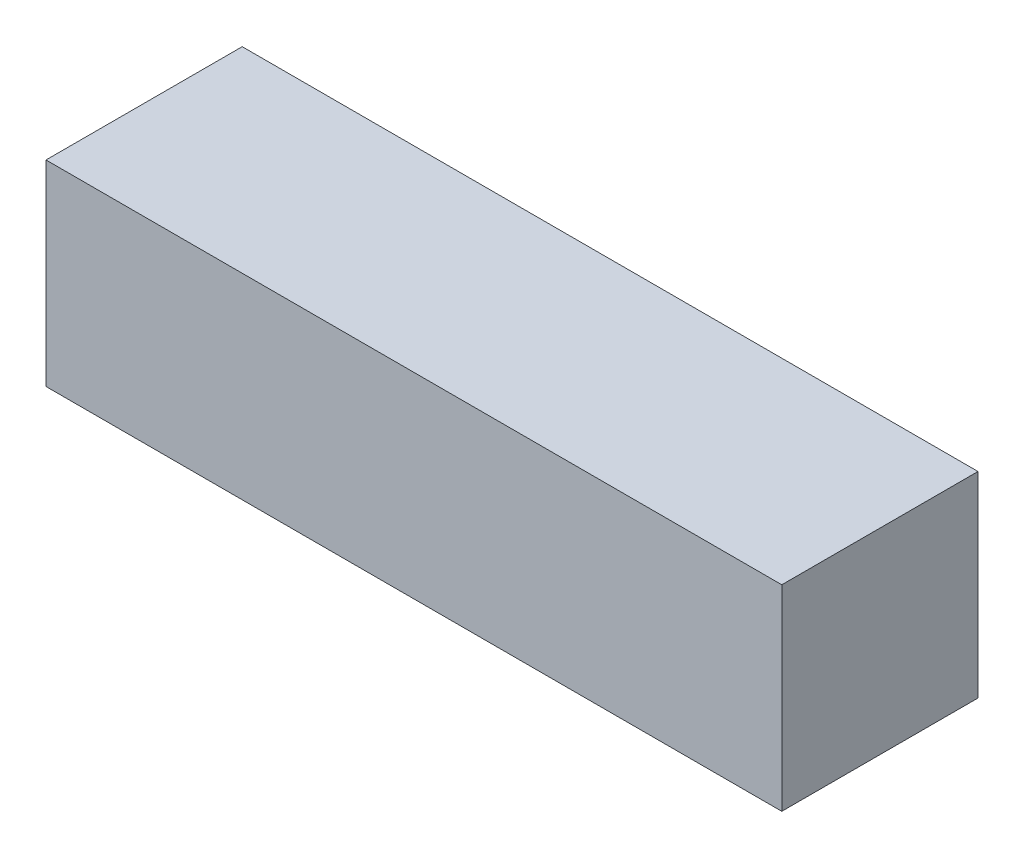
ISO-10303-21;
HEADER;
FILE_DESCRIPTION(('STEP AP214'),'2;1');
FILE_NAME('part.step','',(''),(''),'','','');
FILE_SCHEMA(('AUTOMOTIVE_DESIGN { 1 0 10303 214 1 1 1 1 }'));
ENDSEC;
DATA;
#1=APPLICATION_CONTEXT('core data for automotive mechanical design processes');
#2=APPLICATION_PROTOCOL_DEFINITION('international standard','automotive_design',2000,#1);
#3=PRODUCT_CONTEXT('',#1,'mechanical');
#4=PRODUCT('Part','Part','',(#3));
#5=PRODUCT_RELATED_PRODUCT_CATEGORY('part','',(#4));
#6=PRODUCT_DEFINITION_FORMATION('','',#4);
#7=PRODUCT_DEFINITION_CONTEXT('part definition',#1,'design');
#8=PRODUCT_DEFINITION('design','',#6,#7);
#9=PRODUCT_DEFINITION_SHAPE('','',#8);
#10=(LENGTH_UNIT() NAMED_UNIT(*) SI_UNIT(.MILLI.,.METRE.));
#11=(NAMED_UNIT(*) PLANE_ANGLE_UNIT() SI_UNIT($,.RADIAN.));
#12=(NAMED_UNIT(*) SI_UNIT($,.STERADIAN.) SOLID_ANGLE_UNIT());
#13=UNCERTAINTY_MEASURE_WITH_UNIT(LENGTH_MEASURE(1.E-05),#10,'distance_accuracy_value','');
#14=(GEOMETRIC_REPRESENTATION_CONTEXT(3) GLOBAL_UNCERTAINTY_ASSIGNED_CONTEXT((#13)) GLOBAL_UNIT_ASSIGNED_CONTEXT((#10,
#11,#12)) REPRESENTATION_CONTEXT('',''));
#15=CARTESIAN_POINT('',(0.,0.,0.));
#16=DIRECTION('',(0.,0.,1.));
#17=DIRECTION('',(1.,0.,0.));
#18=AXIS2_PLACEMENT_3D('',#15,#16,#17);
#19=CARTESIAN_POINT('',(0.,40.,0.));
#20=DIRECTION('',(1.,0.,0.));
#21=DIRECTION('',(0.,0.,-1.));
#22=AXIS2_PLACEMENT_3D('',#19,#20,#21);
#23=PLANE('',#22);
#24=DIRECTION('',(0.,0.,1.));
#25=VECTOR('',#24,1.);
#26=CARTESIAN_POINT('',(0.,0.,0.));
#27=LINE('',#26,#25);
#28=CARTESIAN_POINT('',(0.,0.,-40.));
#29=VERTEX_POINT('',#28);
#30=CARTESIAN_POINT('',(0.,0.,0.));
#31=VERTEX_POINT('',#30);
#32=EDGE_CURVE('E96',#29,#31,#27,.T.);
#33=ORIENTED_EDGE('',*,*,#32,.T.);
#34=DIRECTION('',(0.,-1.,0.));
#35=VECTOR('',#34,1.);
#36=CARTESIAN_POINT('',(0.,40.,0.));
#37=LINE('',#36,#35);
#38=CARTESIAN_POINT('',(0.,40.,0.));
#39=VERTEX_POINT('',#38);
#40=EDGE_CURVE('E11',#39,#31,#37,.T.);
#41=ORIENTED_EDGE('',*,*,#40,.F.);
#42=DIRECTION('',(0.,0.,1.));
#43=VECTOR('',#42,1.);
#44=CARTESIAN_POINT('',(0.,40.,0.));
#45=LINE('',#44,#43);
#46=CARTESIAN_POINT('',(0.,40.,-40.));
#47=VERTEX_POINT('',#46);
#48=EDGE_CURVE('E84',#47,#39,#45,.T.);
#49=ORIENTED_EDGE('',*,*,#48,.F.);
#50=DIRECTION('',(0.,-1.,0.));
#51=VECTOR('',#50,1.);
#52=CARTESIAN_POINT('',(0.,40.,-40.));
#53=LINE('',#52,#51);
#54=EDGE_CURVE('E92',#47,#29,#53,.T.);
#55=ORIENTED_EDGE('',*,*,#54,.T.);
#56=EDGE_LOOP('',(#33,#41,#49,#55));
#57=FACE_BOUND('',#56,.T.);
#58=ADVANCED_FACE('F33',(#57),#23,.F.);
#59=CARTESIAN_POINT('',(0.,40.,0.));
#60=DIRECTION('',(0.,0.,-1.));
#61=DIRECTION('',(-1.,0.,0.));
#62=AXIS2_PLACEMENT_3D('',#59,#60,#61);
#63=PLANE('',#62);
#64=DIRECTION('',(1.,0.,0.));
#65=VECTOR('',#64,1.);
#66=CARTESIAN_POINT('',(0.,0.,0.));
#67=LINE('',#66,#65);
#68=CARTESIAN_POINT('',(150.,0.,0.));
#69=VERTEX_POINT('',#68);
#70=EDGE_CURVE('E88',#31,#69,#67,.T.);
#71=ORIENTED_EDGE('',*,*,#70,.T.);
#72=DIRECTION('',(0.,-1.,0.));
#73=VECTOR('',#72,1.);
#74=CARTESIAN_POINT('',(150.,40.,0.));
#75=LINE('',#74,#73);
#76=CARTESIAN_POINT('',(150.,40.,0.));
#77=VERTEX_POINT('',#76);
#78=EDGE_CURVE('E41',#77,#69,#75,.T.);
#79=ORIENTED_EDGE('',*,*,#78,.F.);
#80=DIRECTION('',(1.,0.,0.));
#81=VECTOR('',#80,1.);
#82=CARTESIAN_POINT('',(0.,40.,0.));
#83=LINE('',#82,#81);
#84=EDGE_CURVE('E79',#39,#77,#83,.T.);
#85=ORIENTED_EDGE('',*,*,#84,.F.);
#86=ORIENTED_EDGE('',*,*,#40,.T.);
#87=EDGE_LOOP('',(#71,#79,#85,#86));
#88=FACE_BOUND('',#87,.T.);
#89=ADVANCED_FACE('F87',(#88),#63,.F.);
#90=CARTESIAN_POINT('',(150.,40.,0.));
#91=DIRECTION('',(-1.,0.,0.));
#92=DIRECTION('',(0.,0.,1.));
#93=AXIS2_PLACEMENT_3D('',#90,#91,#92);
#94=PLANE('',#93);
#95=DIRECTION('',(0.,0.,-1.));
#96=VECTOR('',#95,1.);
#97=CARTESIAN_POINT('',(150.,0.,0.));
#98=LINE('',#97,#96);
#99=CARTESIAN_POINT('',(150.,0.,-40.));
#100=VERTEX_POINT('',#99);
#101=EDGE_CURVE('E66',#69,#100,#98,.T.);
#102=ORIENTED_EDGE('',*,*,#101,.T.);
#103=DIRECTION('',(0.,-1.,0.));
#104=VECTOR('',#103,1.);
#105=CARTESIAN_POINT('',(150.,40.,-40.));
#106=LINE('',#105,#104);
#107=CARTESIAN_POINT('',(150.,40.,-40.));
#108=VERTEX_POINT('',#107);
#109=EDGE_CURVE('E89',#108,#100,#106,.T.);
#110=ORIENTED_EDGE('',*,*,#109,.F.);
#111=DIRECTION('',(0.,0.,-1.));
#112=VECTOR('',#111,1.);
#113=CARTESIAN_POINT('',(150.,40.,0.));
#114=LINE('',#113,#112);
#115=EDGE_CURVE('E82',#77,#108,#114,.T.);
#116=ORIENTED_EDGE('',*,*,#115,.F.);
#117=ORIENTED_EDGE('',*,*,#78,.T.);
#118=EDGE_LOOP('',(#102,#110,#116,#117));
#119=FACE_BOUND('',#118,.T.);
#120=ADVANCED_FACE('F90',(#119),#94,.F.);
#121=CARTESIAN_POINT('',(0.,40.,-40.));
#122=DIRECTION('',(0.,0.,1.));
#123=DIRECTION('',(1.,0.,0.));
#124=AXIS2_PLACEMENT_3D('',#121,#122,#123);
#125=PLANE('',#124);
#126=DIRECTION('',(-1.,0.,0.));
#127=VECTOR('',#126,1.);
#128=CARTESIAN_POINT('',(0.,0.,-40.));
#129=LINE('',#128,#127);
#130=EDGE_CURVE('E72',#100,#29,#129,.T.);
#131=ORIENTED_EDGE('',*,*,#130,.T.);
#132=ORIENTED_EDGE('',*,*,#54,.F.);
#133=DIRECTION('',(-1.,0.,0.));
#134=VECTOR('',#133,1.);
#135=CARTESIAN_POINT('',(0.,40.,-40.));
#136=LINE('',#135,#134);
#137=EDGE_CURVE('E49',#108,#47,#136,.T.);
#138=ORIENTED_EDGE('',*,*,#137,.F.);
#139=ORIENTED_EDGE('',*,*,#109,.T.);
#140=EDGE_LOOP('',(#131,#132,#138,#139));
#141=FACE_BOUND('',#140,.T.);
#142=ADVANCED_FACE('F103',(#141),#125,.F.);
#143=CARTESIAN_POINT('',(0.,40.,0.));
#144=DIRECTION('',(0.,-1.,0.));
#145=DIRECTION('',(0.,0.,-1.));
#146=AXIS2_PLACEMENT_3D('',#143,#144,#145);
#147=PLANE('',#146);
#148=ORIENTED_EDGE('',*,*,#48,.T.);
#149=ORIENTED_EDGE('',*,*,#84,.T.);
#150=ORIENTED_EDGE('',*,*,#115,.T.);
#151=ORIENTED_EDGE('',*,*,#137,.T.);
#152=EDGE_LOOP('',(#148,#149,#150,#151));
#153=FACE_BOUND('',#152,.T.);
#154=ADVANCED_FACE('F80',(#153),#147,.F.);
#155=CARTESIAN_POINT('',(0.,0.,0.));
#156=DIRECTION('',(0.,-1.,0.));
#157=DIRECTION('',(0.,0.,-1.));
#158=AXIS2_PLACEMENT_3D('',#155,#156,#157);
#159=PLANE('',#158);
#160=ORIENTED_EDGE('',*,*,#32,.F.);
#161=ORIENTED_EDGE('',*,*,#130,.F.);
#162=ORIENTED_EDGE('',*,*,#101,.F.);
#163=ORIENTED_EDGE('',*,*,#70,.F.);
#164=EDGE_LOOP('',(#160,#161,#162,#163));
#165=FACE_BOUND('',#164,.T.);
#166=ADVANCED_FACE('F106',(#165),#159,.T.);
#167=CLOSED_SHELL('',(#58,#89,#120,#142,#154,#166));
#168=MANIFOLD_SOLID_BREP('B2',#167);
#169=ADVANCED_BREP_SHAPE_REPRESENTATION('',(#18,#168),#14);
#170=SHAPE_DEFINITION_REPRESENTATION(#9,#169);
ENDSEC;
END-ISO-10303-21;
